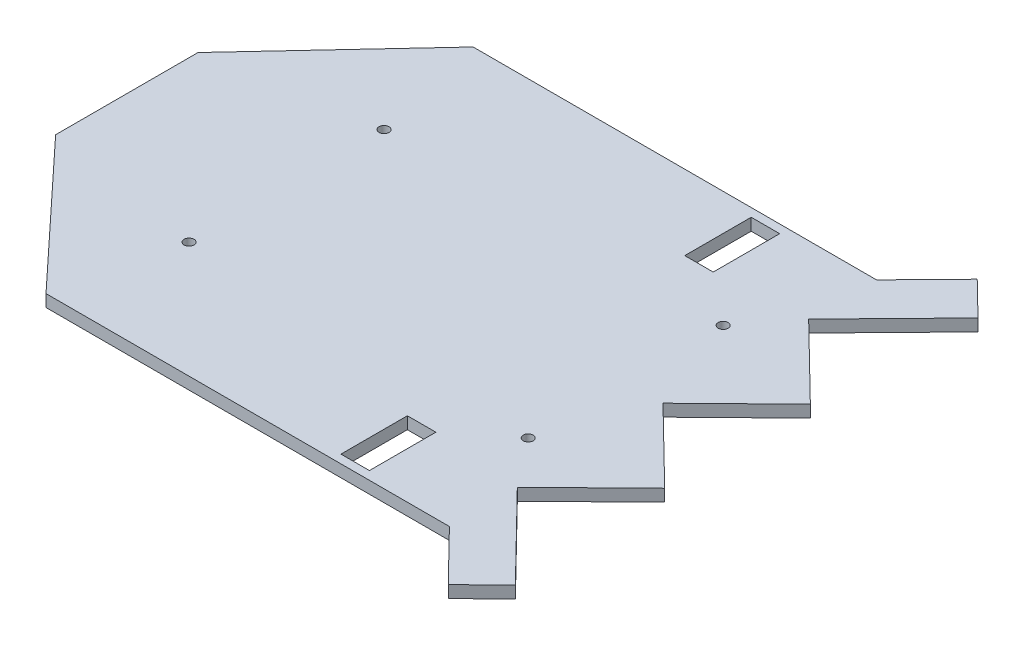
ISO-10303-21;
HEADER;
FILE_DESCRIPTION(('STEP AP214'),'2;1');
FILE_NAME('part.step','',(''),(''),'','','');
FILE_SCHEMA(('AUTOMOTIVE_DESIGN { 1 0 10303 214 1 1 1 1 }'));
ENDSEC;
DATA;
#1=APPLICATION_CONTEXT('core data for automotive mechanical design processes');
#2=APPLICATION_PROTOCOL_DEFINITION('international standard','automotive_design',2000,#1);
#3=PRODUCT_CONTEXT('',#1,'mechanical');
#4=PRODUCT('Part','Part','',(#3));
#5=PRODUCT_RELATED_PRODUCT_CATEGORY('part','',(#4));
#6=PRODUCT_DEFINITION_FORMATION('','',#4);
#7=PRODUCT_DEFINITION_CONTEXT('part definition',#1,'design');
#8=PRODUCT_DEFINITION('design','',#6,#7);
#9=PRODUCT_DEFINITION_SHAPE('','',#8);
#10=(LENGTH_UNIT() NAMED_UNIT(*) SI_UNIT(.MILLI.,.METRE.));
#11=(NAMED_UNIT(*) PLANE_ANGLE_UNIT() SI_UNIT($,.RADIAN.));
#12=(NAMED_UNIT(*) SI_UNIT($,.STERADIAN.) SOLID_ANGLE_UNIT());
#13=UNCERTAINTY_MEASURE_WITH_UNIT(LENGTH_MEASURE(1.E-05),#10,'distance_accuracy_value','');
#14=(GEOMETRIC_REPRESENTATION_CONTEXT(3) GLOBAL_UNCERTAINTY_ASSIGNED_CONTEXT((#13)) GLOBAL_UNIT_ASSIGNED_CONTEXT((#10,
#11,#12)) REPRESENTATION_CONTEXT('',''));
#15=CARTESIAN_POINT('',(0.,0.,0.));
#16=DIRECTION('',(0.,0.,1.));
#17=DIRECTION('',(1.,0.,0.));
#18=AXIS2_PLACEMENT_3D('',#15,#16,#17);
#19=CARTESIAN_POINT('',(0.,-0.1,0.));
#20=DIRECTION('',(0.,1.,0.));
#21=DIRECTION('',(0.,0.,1.));
#22=AXIS2_PLACEMENT_3D('',#19,#20,#21);
#23=PLANE('',#22);
#24=DIRECTION('',(0.71519160898376,0.,-0.69892843871116));
#25=VECTOR('',#24,1.);
#26=CARTESIAN_POINT('',(246.912660031566,-0.1,111.455748269513));
#27=LINE('',#26,#25);
#28=CARTESIAN_POINT('',(246.912660031566,-0.1,111.455748269513));
#29=VERTEX_POINT('',#28);
#30=CARTESIAN_POINT('',(261.216492211241,-0.1,97.4771794952896));
#31=VERTEX_POINT('',#30);
#32=EDGE_CURVE('E297',#29,#31,#27,.T.);
#33=ORIENTED_EDGE('',*,*,#32,.F.);
#34=DIRECTION('',(0.698928438711159,0.,0.715191608983762));
#35=VECTOR('',#34,1.);
#36=CARTESIAN_POINT('',(225.944806870231,-0.1,90.));
#37=LINE('',#36,#35);
#38=CARTESIAN_POINT('',(225.944806870231,-0.1,90.));
#39=VERTEX_POINT('',#38);
#40=EDGE_CURVE('E339',#39,#29,#37,.T.);
#41=ORIENTED_EDGE('',*,*,#40,.F.);
#42=DIRECTION('',(1.,0.,0.));
#43=VECTOR('',#42,1.);
#44=CARTESIAN_POINT('',(55.9448068702312,-0.1,90.));
#45=LINE('',#44,#43);
#46=CARTESIAN_POINT('',(55.9448068702312,-0.1,90.));
#47=VERTEX_POINT('',#46);
#48=EDGE_CURVE('E336',#47,#39,#45,.T.);
#49=ORIENTED_EDGE('',*,*,#48,.F.);
#50=DIRECTION('',(0.681958597642219,0.,0.731390778655199));
#51=VECTOR('',#50,1.);
#52=CARTESIAN_POINT('',(0.,-0.1,30.));
#53=LINE('',#52,#51);
#54=CARTESIAN_POINT('',(0.,-0.1,30.));
#55=VERTEX_POINT('',#54);
#56=EDGE_CURVE('E333',#55,#47,#53,.T.);
#57=ORIENTED_EDGE('',*,*,#56,.F.);
#58=DIRECTION('',(0.,0.,1.));
#59=VECTOR('',#58,1.);
#60=CARTESIAN_POINT('',(0.,-0.1,30.));
#61=LINE('',#60,#59);
#62=CARTESIAN_POINT('',(0.,-0.1,-30.));
#63=VERTEX_POINT('',#62);
#64=EDGE_CURVE('E330',#63,#55,#61,.T.);
#65=ORIENTED_EDGE('',*,*,#64,.F.);
#66=DIRECTION('',(-0.68195859764222,0.,0.731390778655198));
#67=VECTOR('',#66,1.);
#68=CARTESIAN_POINT('',(0.,-0.1,-30.));
#69=LINE('',#68,#67);
#70=CARTESIAN_POINT('',(55.9448068702314,-0.1,-90.));
#71=VERTEX_POINT('',#70);
#72=EDGE_CURVE('E327',#71,#63,#69,.T.);
#73=ORIENTED_EDGE('',*,*,#72,.F.);
#74=DIRECTION('',(-1.,0.,0.));
#75=VECTOR('',#74,1.);
#76=CARTESIAN_POINT('',(55.9448068702314,-0.1,-90.));
#77=LINE('',#76,#75);
#78=CARTESIAN_POINT('',(225.944806870231,-0.1,-90.));
#79=VERTEX_POINT('',#78);
#80=EDGE_CURVE('E324',#79,#71,#77,.T.);
#81=ORIENTED_EDGE('',*,*,#80,.F.);
#82=DIRECTION('',(-0.698928438711159,0.,0.715191608983762));
#83=VECTOR('',#82,1.);
#84=CARTESIAN_POINT('',(225.944806870231,-0.1,-90.));
#85=LINE('',#84,#83);
#86=CARTESIAN_POINT('',(246.912660031566,-0.1,-111.455748269513));
#87=VERTEX_POINT('',#86);
#88=EDGE_CURVE('E321',#87,#79,#85,.T.);
#89=ORIENTED_EDGE('',*,*,#88,.F.);
#90=DIRECTION('',(-0.71519160898376,0.,-0.69892843871116));
#91=VECTOR('',#90,1.);
#92=CARTESIAN_POINT('',(246.912660031566,-0.1,-111.455748269513));
#93=LINE('',#92,#91);
#94=CARTESIAN_POINT('',(261.216492211241,-0.1,-97.4771794952896));
#95=VERTEX_POINT('',#94);
#96=EDGE_CURVE('E318',#95,#87,#93,.T.);
#97=ORIENTED_EDGE('',*,*,#96,.F.);
#98=DIRECTION('',(0.698928438711159,0.,-0.715191608983762));
#99=VECTOR('',#98,1.);
#100=CARTESIAN_POINT('',(261.216492211241,-0.1,-97.4771794952896));
#101=LINE('',#100,#99);
#102=CARTESIAN_POINT('',(225.944806870231,-0.1,-61.3847671774803));
#103=VERTEX_POINT('',#102);
#104=EDGE_CURVE('E315',#103,#95,#101,.T.);
#105=ORIENTED_EDGE('',*,*,#104,.F.);
#106=DIRECTION('',(-0.715191608983761,0.,-0.69892843871116));
#107=VECTOR('',#106,1.);
#108=CARTESIAN_POINT('',(225.944806870231,-0.1,-61.3847671774803));
#109=LINE('',#108,#107);
#110=CARTESIAN_POINT('',(257.353801996435,-0.1,-30.69));
#111=VERTEX_POINT('',#110);
#112=EDGE_CURVE('E312',#111,#103,#109,.T.);
#113=ORIENTED_EDGE('',*,*,#112,.F.);
#114=DIRECTION('',(0.715245871572463,0.,-0.69887290918918));
#115=VECTOR('',#114,1.);
#116=CARTESIAN_POINT('',(257.353801996435,-0.1,-30.69));
#117=LINE('',#116,#115);
#118=CARTESIAN_POINT('',(225.944806870231,-0.1,0.));
#119=VERTEX_POINT('',#118);
#120=EDGE_CURVE('E309',#119,#111,#117,.T.);
#121=ORIENTED_EDGE('',*,*,#120,.F.);
#122=DIRECTION('',(-0.715245871572463,0.,-0.69887290918918));
#123=VECTOR('',#122,1.);
#124=CARTESIAN_POINT('',(257.353801996435,-0.1,30.69));
#125=LINE('',#124,#123);
#126=CARTESIAN_POINT('',(257.353801996435,-0.1,30.69));
#127=VERTEX_POINT('',#126);
#128=EDGE_CURVE('E306',#127,#119,#125,.T.);
#129=ORIENTED_EDGE('',*,*,#128,.F.);
#130=DIRECTION('',(0.715191608983761,0.,-0.69892843871116));
#131=VECTOR('',#130,1.);
#132=CARTESIAN_POINT('',(225.944806870231,-0.1,61.3847671774803));
#133=LINE('',#132,#131);
#134=CARTESIAN_POINT('',(225.944806870231,-0.1,61.3847671774803));
#135=VERTEX_POINT('',#134);
#136=EDGE_CURVE('E303',#135,#127,#133,.T.);
#137=ORIENTED_EDGE('',*,*,#136,.F.);
#138=DIRECTION('',(-0.698928438711159,0.,-0.715191608983762));
#139=VECTOR('',#138,1.);
#140=CARTESIAN_POINT('',(261.216492211241,-0.1,97.4771794952896));
#141=LINE('',#140,#139);
#142=EDGE_CURVE('E300',#31,#135,#141,.T.);
#143=ORIENTED_EDGE('',*,*,#142,.F.);
#144=EDGE_LOOP('',(#33,#41,#49,#57,#65,#73,#81,#89,#97,#105,#113,#121,#129,#137,#143));
#145=FACE_BOUND('',#144,.T.);
#146=CARTESIAN_POINT('',(67.3097527531761,-0.1,-41.0819672181388));
#147=DIRECTION('',(0.,-1.,0.));
#148=DIRECTION('',(0.,0.,-1.));
#149=AXIS2_PLACEMENT_3D('',#146,#147,#148);
#150=CIRCLE('',#149,2.1);
#151=CARTESIAN_POINT('',(67.3097527531761,-0.1,-43.1819672181388));
#152=VERTEX_POINT('',#151);
#153=EDGE_CURVE('E242',#152,#152,#150,.T.);
#154=ORIENTED_EDGE('',*,*,#153,.F.);
#155=EDGE_LOOP('',(#154));
#156=FACE_BOUND('',#155,.T.);
#157=CARTESIAN_POINT('',(210.227358503643,-0.1,-41.0819672181388));
#158=DIRECTION('',(0.,-1.,0.));
#159=DIRECTION('',(0.,0.,-1.));
#160=AXIS2_PLACEMENT_3D('',#157,#158,#159);
#161=CIRCLE('',#160,2.09999999999999);
#162=CARTESIAN_POINT('',(210.227358503643,-0.1,-43.1819672181388));
#163=VERTEX_POINT('',#162);
#164=EDGE_CURVE('E239',#163,#163,#161,.T.);
#165=ORIENTED_EDGE('',*,*,#164,.F.);
#166=EDGE_LOOP('',(#165));
#167=FACE_BOUND('',#166,.T.);
#168=CARTESIAN_POINT('',(210.227358503643,-0.1,41.0819672181388));
#169=DIRECTION('',(0.,-1.,0.));
#170=DIRECTION('',(0.,0.,1.));
#171=AXIS2_PLACEMENT_3D('',#168,#169,#170);
#172=CIRCLE('',#171,2.09999999999999);
#173=CARTESIAN_POINT('',(210.227358503643,-0.1,43.1819672181388));
#174=VERTEX_POINT('',#173);
#175=EDGE_CURVE('E243',#174,#174,#172,.T.);
#176=ORIENTED_EDGE('',*,*,#175,.F.);
#177=EDGE_LOOP('',(#176));
#178=FACE_BOUND('',#177,.T.);
#179=CARTESIAN_POINT('',(67.3097527531761,-0.1,41.0819672181388));
#180=DIRECTION('',(0.,-1.,0.));
#181=DIRECTION('',(0.,0.,1.));
#182=AXIS2_PLACEMENT_3D('',#179,#180,#181);
#183=CIRCLE('',#182,2.1);
#184=CARTESIAN_POINT('',(67.3097527531761,-0.1,43.1819672181388));
#185=VERTEX_POINT('',#184);
#186=EDGE_CURVE('E197',#185,#185,#183,.T.);
#187=ORIENTED_EDGE('',*,*,#186,.F.);
#188=EDGE_LOOP('',(#187));
#189=FACE_BOUND('',#188,.T.);
#190=DIRECTION('',(-1.,0.,0.));
#191=VECTOR('',#190,1.);
#192=CARTESIAN_POINT('',(188.67460317135,-0.1,-58.444256033032));
#193=LINE('',#192,#191);
#194=CARTESIAN_POINT('',(188.67460317135,-0.1,-58.444256033032));
#195=VERTEX_POINT('',#194);
#196=CARTESIAN_POINT('',(176.67460317135,-0.1,-58.444256033032));
#197=VERTEX_POINT('',#196);
#198=EDGE_CURVE('E213',#195,#197,#193,.T.);
#199=ORIENTED_EDGE('',*,*,#198,.F.);
#200=DIRECTION('',(0.,0.,1.));
#201=VECTOR('',#200,1.);
#202=CARTESIAN_POINT('',(188.67460317135,-0.1,-86.444256033032));
#203=LINE('',#202,#201);
#204=CARTESIAN_POINT('',(188.67460317135,-0.1,-86.444256033032));
#205=VERTEX_POINT('',#204);
#206=EDGE_CURVE('E60',#205,#195,#203,.T.);
#207=ORIENTED_EDGE('',*,*,#206,.F.);
#208=DIRECTION('',(-1.,0.,0.));
#209=VECTOR('',#208,1.);
#210=CARTESIAN_POINT('',(188.67460317135,-0.1,-86.444256033032));
#211=LINE('',#210,#209);
#212=CARTESIAN_POINT('',(176.67460317135,-0.1,-86.444256033032));
#213=VERTEX_POINT('',#212);
#214=EDGE_CURVE('E225',#205,#213,#211,.T.);
#215=ORIENTED_EDGE('',*,*,#214,.T.);
#216=DIRECTION('',(0.,0.,1.));
#217=VECTOR('',#216,1.);
#218=CARTESIAN_POINT('',(176.67460317135,-0.1,-86.444256033032));
#219=LINE('',#218,#217);
#220=EDGE_CURVE('E234',#213,#197,#219,.T.);
#221=ORIENTED_EDGE('',*,*,#220,.T.);
#222=EDGE_LOOP('',(#199,#207,#215,#221));
#223=FACE_BOUND('',#222,.T.);
#224=DIRECTION('',(-1.,0.,0.));
#225=VECTOR('',#224,1.);
#226=CARTESIAN_POINT('',(188.67460317135,-0.1,58.444256033032));
#227=LINE('',#226,#225);
#228=CARTESIAN_POINT('',(188.67460317135,-0.1,58.444256033032));
#229=VERTEX_POINT('',#228);
#230=CARTESIAN_POINT('',(176.67460317135,-0.1,58.444256033032));
#231=VERTEX_POINT('',#230);
#232=EDGE_CURVE('E52',#229,#231,#227,.T.);
#233=ORIENTED_EDGE('',*,*,#232,.T.);
#234=DIRECTION('',(0.,0.,-1.));
#235=VECTOR('',#234,1.);
#236=CARTESIAN_POINT('',(176.67460317135,-0.1,86.444256033032));
#237=LINE('',#236,#235);
#238=CARTESIAN_POINT('',(176.67460317135,-0.1,86.444256033032));
#239=VERTEX_POINT('',#238);
#240=EDGE_CURVE('E201',#239,#231,#237,.T.);
#241=ORIENTED_EDGE('',*,*,#240,.F.);
#242=DIRECTION('',(-1.,0.,0.));
#243=VECTOR('',#242,1.);
#244=CARTESIAN_POINT('',(188.67460317135,-0.1,86.444256033032));
#245=LINE('',#244,#243);
#246=CARTESIAN_POINT('',(188.67460317135,-0.1,86.444256033032));
#247=VERTEX_POINT('',#246);
#248=EDGE_CURVE('E207',#247,#239,#245,.T.);
#249=ORIENTED_EDGE('',*,*,#248,.F.);
#250=DIRECTION('',(0.,0.,-1.));
#251=VECTOR('',#250,1.);
#252=CARTESIAN_POINT('',(188.67460317135,-0.1,86.444256033032));
#253=LINE('',#252,#251);
#254=EDGE_CURVE('E211',#247,#229,#253,.T.);
#255=ORIENTED_EDGE('',*,*,#254,.T.);
#256=EDGE_LOOP('',(#233,#241,#249,#255));
#257=FACE_BOUND('',#256,.T.);
#258=ADVANCED_FACE('F37',(#145,#156,#167,#178,#189,#223,#257),#23,.F.);
#259=CARTESIAN_POINT('',(0.,5.,0.));
#260=DIRECTION('',(0.,1.,0.));
#261=DIRECTION('',(0.,0.,1.));
#262=AXIS2_PLACEMENT_3D('',#259,#260,#261);
#263=PLANE('',#262);
#264=DIRECTION('',(0.,0.,-1.));
#265=VECTOR('',#264,1.);
#266=CARTESIAN_POINT('',(188.67460317135,5.,0.));
#267=LINE('',#266,#265);
#268=CARTESIAN_POINT('',(188.67460317135,5.,-58.444256033032));
#269=VERTEX_POINT('',#268);
#270=CARTESIAN_POINT('',(188.67460317135,5.,-86.444256033032));
#271=VERTEX_POINT('',#270);
#272=EDGE_CURVE('E390',#269,#271,#267,.T.);
#273=ORIENTED_EDGE('',*,*,#272,.F.);
#274=DIRECTION('',(1.,0.,0.));
#275=VECTOR('',#274,1.);
#276=CARTESIAN_POINT('',(0.,5.,-58.444256033032));
#277=LINE('',#276,#275);
#278=CARTESIAN_POINT('',(176.67460317135,5.,-58.444256033032));
#279=VERTEX_POINT('',#278);
#280=EDGE_CURVE('E345',#279,#269,#277,.T.);
#281=ORIENTED_EDGE('',*,*,#280,.F.);
#282=DIRECTION('',(0.,0.,-1.));
#283=VECTOR('',#282,1.);
#284=CARTESIAN_POINT('',(176.67460317135,5.,0.));
#285=LINE('',#284,#283);
#286=CARTESIAN_POINT('',(176.67460317135,5.,-86.444256033032));
#287=VERTEX_POINT('',#286);
#288=EDGE_CURVE('E384',#279,#287,#285,.T.);
#289=ORIENTED_EDGE('',*,*,#288,.T.);
#290=DIRECTION('',(1.,0.,0.));
#291=VECTOR('',#290,1.);
#292=CARTESIAN_POINT('',(0.,5.,-86.444256033032));
#293=LINE('',#292,#291);
#294=EDGE_CURVE('E387',#287,#271,#293,.T.);
#295=ORIENTED_EDGE('',*,*,#294,.T.);
#296=EDGE_LOOP('',(#273,#281,#289,#295));
#297=FACE_BOUND('',#296,.T.);
#298=CARTESIAN_POINT('',(67.3097527531761,5.,41.0819672181388));
#299=DIRECTION('',(0.,1.,0.));
#300=DIRECTION('',(0.,0.,1.));
#301=AXIS2_PLACEMENT_3D('',#298,#299,#300);
#302=CIRCLE('',#301,2.1);
#303=CARTESIAN_POINT('',(67.3097527531761,5.,43.1819672181388));
#304=VERTEX_POINT('',#303);
#305=EDGE_CURVE('E255',#304,#304,#302,.T.);
#306=ORIENTED_EDGE('',*,*,#305,.F.);
#307=EDGE_LOOP('',(#306));
#308=FACE_BOUND('',#307,.T.);
#309=CARTESIAN_POINT('',(210.227358503643,5.,41.0819672181388));
#310=DIRECTION('',(0.,1.,0.));
#311=DIRECTION('',(0.,0.,1.));
#312=AXIS2_PLACEMENT_3D('',#309,#310,#311);
#313=CIRCLE('',#312,2.09999999999999);
#314=CARTESIAN_POINT('',(210.227358503643,5.,43.1819672181388));
#315=VERTEX_POINT('',#314);
#316=EDGE_CURVE('E378',#315,#315,#313,.T.);
#317=ORIENTED_EDGE('',*,*,#316,.F.);
#318=EDGE_LOOP('',(#317));
#319=FACE_BOUND('',#318,.T.);
#320=CARTESIAN_POINT('',(210.227358503643,5.,-41.0819672181388));
#321=DIRECTION('',(0.,1.,0.));
#322=DIRECTION('',(0.,0.,1.));
#323=AXIS2_PLACEMENT_3D('',#320,#321,#322);
#324=CIRCLE('',#323,2.09999999999999);
#325=CARTESIAN_POINT('',(210.227358503643,5.,-38.9819672181388));
#326=VERTEX_POINT('',#325);
#327=EDGE_CURVE('E375',#326,#326,#324,.T.);
#328=ORIENTED_EDGE('',*,*,#327,.F.);
#329=EDGE_LOOP('',(#328));
#330=FACE_BOUND('',#329,.T.);
#331=CARTESIAN_POINT('',(67.3097527531761,5.,-41.0819672181388));
#332=DIRECTION('',(0.,1.,0.));
#333=DIRECTION('',(0.,0.,1.));
#334=AXIS2_PLACEMENT_3D('',#331,#332,#333);
#335=CIRCLE('',#334,2.1);
#336=CARTESIAN_POINT('',(67.3097527531761,5.,-38.9819672181388));
#337=VERTEX_POINT('',#336);
#338=EDGE_CURVE('E250',#337,#337,#335,.T.);
#339=ORIENTED_EDGE('',*,*,#338,.F.);
#340=EDGE_LOOP('',(#339));
#341=FACE_BOUND('',#340,.T.);
#342=DIRECTION('',(0.71519160898376,0.,-0.69892843871116));
#343=VECTOR('',#342,1.);
#344=CARTESIAN_POINT('',(246.912660031566,5.,111.455748269513));
#345=LINE('',#344,#343);
#346=CARTESIAN_POINT('',(246.912660031566,5.,111.455748269513));
#347=VERTEX_POINT('',#346);
#348=CARTESIAN_POINT('',(261.216492211241,5.,97.4771794952896));
#349=VERTEX_POINT('',#348);
#350=EDGE_CURVE('E251',#347,#349,#345,.T.);
#351=ORIENTED_EDGE('',*,*,#350,.T.);
#352=DIRECTION('',(-0.698928438711159,0.,-0.715191608983762));
#353=VECTOR('',#352,1.);
#354=CARTESIAN_POINT('',(261.216492211241,5.,97.4771794952896));
#355=LINE('',#354,#353);
#356=CARTESIAN_POINT('',(225.944806870231,5.,61.3847671774803));
#357=VERTEX_POINT('',#356);
#358=EDGE_CURVE('E254',#349,#357,#355,.T.);
#359=ORIENTED_EDGE('',*,*,#358,.T.);
#360=DIRECTION('',(0.715191608983761,0.,-0.69892843871116));
#361=VECTOR('',#360,1.);
#362=CARTESIAN_POINT('',(225.944806870231,5.,61.3847671774803));
#363=LINE('',#362,#361);
#364=CARTESIAN_POINT('',(257.353801996435,5.,30.69));
#365=VERTEX_POINT('',#364);
#366=EDGE_CURVE('E258',#357,#365,#363,.T.);
#367=ORIENTED_EDGE('',*,*,#366,.T.);
#368=DIRECTION('',(-0.715245871572463,0.,-0.69887290918918));
#369=VECTOR('',#368,1.);
#370=CARTESIAN_POINT('',(257.353801996435,5.,30.69));
#371=LINE('',#370,#369);
#372=CARTESIAN_POINT('',(225.944806870231,5.,0.));
#373=VERTEX_POINT('',#372);
#374=EDGE_CURVE('E261',#365,#373,#371,.T.);
#375=ORIENTED_EDGE('',*,*,#374,.T.);
#376=DIRECTION('',(0.715245871572463,0.,-0.69887290918918));
#377=VECTOR('',#376,1.);
#378=CARTESIAN_POINT('',(257.353801996435,5.,-30.69));
#379=LINE('',#378,#377);
#380=CARTESIAN_POINT('',(257.353801996435,5.,-30.69));
#381=VERTEX_POINT('',#380);
#382=EDGE_CURVE('E264',#373,#381,#379,.T.);
#383=ORIENTED_EDGE('',*,*,#382,.T.);
#384=DIRECTION('',(-0.715191608983761,0.,-0.69892843871116));
#385=VECTOR('',#384,1.);
#386=CARTESIAN_POINT('',(225.944806870231,5.,-61.3847671774803));
#387=LINE('',#386,#385);
#388=CARTESIAN_POINT('',(225.944806870231,5.,-61.3847671774803));
#389=VERTEX_POINT('',#388);
#390=EDGE_CURVE('E267',#381,#389,#387,.T.);
#391=ORIENTED_EDGE('',*,*,#390,.T.);
#392=DIRECTION('',(0.698928438711159,0.,-0.715191608983762));
#393=VECTOR('',#392,1.);
#394=CARTESIAN_POINT('',(261.216492211241,5.,-97.4771794952896));
#395=LINE('',#394,#393);
#396=CARTESIAN_POINT('',(261.216492211241,5.,-97.4771794952896));
#397=VERTEX_POINT('',#396);
#398=EDGE_CURVE('E270',#389,#397,#395,.T.);
#399=ORIENTED_EDGE('',*,*,#398,.T.);
#400=DIRECTION('',(-0.71519160898376,0.,-0.69892843871116));
#401=VECTOR('',#400,1.);
#402=CARTESIAN_POINT('',(246.912660031566,5.,-111.455748269513));
#403=LINE('',#402,#401);
#404=CARTESIAN_POINT('',(246.912660031566,5.,-111.455748269513));
#405=VERTEX_POINT('',#404);
#406=EDGE_CURVE('E273',#397,#405,#403,.T.);
#407=ORIENTED_EDGE('',*,*,#406,.T.);
#408=DIRECTION('',(-0.698928438711159,0.,0.715191608983762));
#409=VECTOR('',#408,1.);
#410=CARTESIAN_POINT('',(225.944806870231,5.,-90.));
#411=LINE('',#410,#409);
#412=CARTESIAN_POINT('',(225.944806870231,5.,-90.));
#413=VERTEX_POINT('',#412);
#414=EDGE_CURVE('E276',#405,#413,#411,.T.);
#415=ORIENTED_EDGE('',*,*,#414,.T.);
#416=DIRECTION('',(-1.,0.,0.));
#417=VECTOR('',#416,1.);
#418=CARTESIAN_POINT('',(55.9448068702314,5.,-90.));
#419=LINE('',#418,#417);
#420=CARTESIAN_POINT('',(55.9448068702314,5.,-90.));
#421=VERTEX_POINT('',#420);
#422=EDGE_CURVE('E279',#413,#421,#419,.T.);
#423=ORIENTED_EDGE('',*,*,#422,.T.);
#424=DIRECTION('',(-0.68195859764222,0.,0.731390778655198));
#425=VECTOR('',#424,1.);
#426=CARTESIAN_POINT('',(0.,5.,-30.));
#427=LINE('',#426,#425);
#428=CARTESIAN_POINT('',(0.,5.,-30.));
#429=VERTEX_POINT('',#428);
#430=EDGE_CURVE('E282',#421,#429,#427,.T.);
#431=ORIENTED_EDGE('',*,*,#430,.T.);
#432=DIRECTION('',(0.,0.,1.));
#433=VECTOR('',#432,1.);
#434=CARTESIAN_POINT('',(0.,5.,30.));
#435=LINE('',#434,#433);
#436=CARTESIAN_POINT('',(0.,5.,30.));
#437=VERTEX_POINT('',#436);
#438=EDGE_CURVE('E285',#429,#437,#435,.T.);
#439=ORIENTED_EDGE('',*,*,#438,.T.);
#440=DIRECTION('',(0.681958597642219,0.,0.731390778655199));
#441=VECTOR('',#440,1.);
#442=CARTESIAN_POINT('',(0.,5.,30.));
#443=LINE('',#442,#441);
#444=CARTESIAN_POINT('',(55.9448068702312,5.,90.));
#445=VERTEX_POINT('',#444);
#446=EDGE_CURVE('E288',#437,#445,#443,.T.);
#447=ORIENTED_EDGE('',*,*,#446,.T.);
#448=DIRECTION('',(1.,0.,0.));
#449=VECTOR('',#448,1.);
#450=CARTESIAN_POINT('',(55.9448068702312,5.,90.));
#451=LINE('',#450,#449);
#452=CARTESIAN_POINT('',(225.944806870231,5.,90.));
#453=VERTEX_POINT('',#452);
#454=EDGE_CURVE('E291',#445,#453,#451,.T.);
#455=ORIENTED_EDGE('',*,*,#454,.T.);
#456=DIRECTION('',(0.698928438711159,0.,0.715191608983762));
#457=VECTOR('',#456,1.);
#458=CARTESIAN_POINT('',(225.944806870231,5.,90.));
#459=LINE('',#458,#457);
#460=EDGE_CURVE('E294',#453,#347,#459,.T.);
#461=ORIENTED_EDGE('',*,*,#460,.T.);
#462=EDGE_LOOP('',(#351,#359,#367,#375,#383,#391,#399,#407,#415,#423,#431,#439,#447,#455,#461));
#463=FACE_BOUND('',#462,.T.);
#464=DIRECTION('',(0.,0.,1.));
#465=VECTOR('',#464,1.);
#466=CARTESIAN_POINT('',(176.67460317135,5.,0.));
#467=LINE('',#466,#465);
#468=CARTESIAN_POINT('',(176.67460317135,5.,58.444256033032));
#469=VERTEX_POINT('',#468);
#470=CARTESIAN_POINT('',(176.67460317135,5.,86.444256033032));
#471=VERTEX_POINT('',#470);
#472=EDGE_CURVE('E45',#469,#471,#467,.T.);
#473=ORIENTED_EDGE('',*,*,#472,.F.);
#474=DIRECTION('',(1.,0.,0.));
#475=VECTOR('',#474,1.);
#476=CARTESIAN_POINT('',(0.,5.,58.444256033032));
#477=LINE('',#476,#475);
#478=CARTESIAN_POINT('',(188.67460317135,5.,58.444256033032));
#479=VERTEX_POINT('',#478);
#480=EDGE_CURVE('E11',#469,#479,#477,.T.);
#481=ORIENTED_EDGE('',*,*,#480,.T.);
#482=DIRECTION('',(0.,0.,1.));
#483=VECTOR('',#482,1.);
#484=CARTESIAN_POINT('',(188.67460317135,5.,0.));
#485=LINE('',#484,#483);
#486=CARTESIAN_POINT('',(188.67460317135,5.,86.444256033032));
#487=VERTEX_POINT('',#486);
#488=EDGE_CURVE('E392',#479,#487,#485,.T.);
#489=ORIENTED_EDGE('',*,*,#488,.T.);
#490=DIRECTION('',(1.,0.,0.));
#491=VECTOR('',#490,1.);
#492=CARTESIAN_POINT('',(0.,5.,86.444256033032));
#493=LINE('',#492,#491);
#494=EDGE_CURVE('E395',#471,#487,#493,.T.);
#495=ORIENTED_EDGE('',*,*,#494,.F.);
#496=EDGE_LOOP('',(#473,#481,#489,#495));
#497=FACE_BOUND('',#496,.T.);
#498=ADVANCED_FACE('F401',(#297,#308,#319,#330,#341,#463,#497),#263,.T.);
#499=CARTESIAN_POINT('',(246.912660031566,-0.1,111.455748269513));
#500=DIRECTION('',(0.69892843871116,0.,0.71519160898376));
#501=DIRECTION('',(0.71519160898376,0.,-0.69892843871116));
#502=AXIS2_PLACEMENT_3D('',#499,#500,#501);
#503=PLANE('',#502);
#504=DIRECTION('',(0.,1.,0.));
#505=VECTOR('',#504,1.);
#506=CARTESIAN_POINT('',(261.216492211241,-0.1,97.4771794952896));
#507=LINE('',#506,#505);
#508=EDGE_CURVE('E342',#31,#349,#507,.T.);
#509=ORIENTED_EDGE('',*,*,#508,.T.);
#510=ORIENTED_EDGE('',*,*,#350,.F.);
#511=DIRECTION('',(0.,1.,0.));
#512=VECTOR('',#511,1.);
#513=CARTESIAN_POINT('',(246.912660031566,-0.1,111.455748269513));
#514=LINE('',#513,#512);
#515=EDGE_CURVE('E343',#29,#347,#514,.T.);
#516=ORIENTED_EDGE('',*,*,#515,.F.);
#517=ORIENTED_EDGE('',*,*,#32,.T.);
#518=EDGE_LOOP('',(#509,#510,#516,#517));
#519=FACE_BOUND('',#518,.T.);
#520=ADVANCED_FACE('F39',(#519),#503,.T.);
#521=CARTESIAN_POINT('',(225.944806870231,-0.1,90.));
#522=DIRECTION('',(-0.715191608983762,0.,0.698928438711159));
#523=DIRECTION('',(0.698928438711159,0.,0.715191608983762));
#524=AXIS2_PLACEMENT_3D('',#521,#522,#523);
#525=PLANE('',#524);
#526=ORIENTED_EDGE('',*,*,#515,.T.);
#527=ORIENTED_EDGE('',*,*,#460,.F.);
#528=DIRECTION('',(0.,1.,0.));
#529=VECTOR('',#528,1.);
#530=CARTESIAN_POINT('',(225.944806870231,-0.1,90.));
#531=LINE('',#530,#529);
#532=EDGE_CURVE('E346',#39,#453,#531,.T.);
#533=ORIENTED_EDGE('',*,*,#532,.F.);
#534=ORIENTED_EDGE('',*,*,#40,.T.);
#535=EDGE_LOOP('',(#526,#527,#533,#534));
#536=FACE_BOUND('',#535,.T.);
#537=ADVANCED_FACE('F422',(#536),#525,.T.);
#538=CARTESIAN_POINT('',(55.9448068702312,-0.1,90.));
#539=DIRECTION('',(0.,0.,1.));
#540=DIRECTION('',(1.,0.,0.));
#541=AXIS2_PLACEMENT_3D('',#538,#539,#540);
#542=PLANE('',#541);
#543=ORIENTED_EDGE('',*,*,#532,.T.);
#544=ORIENTED_EDGE('',*,*,#454,.F.);
#545=DIRECTION('',(0.,1.,0.));
#546=VECTOR('',#545,1.);
#547=CARTESIAN_POINT('',(55.9448068702312,-0.1,90.));
#548=LINE('',#547,#546);
#549=EDGE_CURVE('E348',#47,#445,#548,.T.);
#550=ORIENTED_EDGE('',*,*,#549,.F.);
#551=ORIENTED_EDGE('',*,*,#48,.T.);
#552=EDGE_LOOP('',(#543,#544,#550,#551));
#553=FACE_BOUND('',#552,.T.);
#554=ADVANCED_FACE('F425',(#553),#542,.T.);
#555=CARTESIAN_POINT('',(0.,-0.1,30.));
#556=DIRECTION('',(-0.731390778655199,0.,0.681958597642219));
#557=DIRECTION('',(0.681958597642219,0.,0.731390778655199));
#558=AXIS2_PLACEMENT_3D('',#555,#556,#557);
#559=PLANE('',#558);
#560=ORIENTED_EDGE('',*,*,#549,.T.);
#561=ORIENTED_EDGE('',*,*,#446,.F.);
#562=DIRECTION('',(0.,1.,0.));
#563=VECTOR('',#562,1.);
#564=CARTESIAN_POINT('',(0.,-0.1,30.));
#565=LINE('',#564,#563);
#566=EDGE_CURVE('E350',#55,#437,#565,.T.);
#567=ORIENTED_EDGE('',*,*,#566,.F.);
#568=ORIENTED_EDGE('',*,*,#56,.T.);
#569=EDGE_LOOP('',(#560,#561,#567,#568));
#570=FACE_BOUND('',#569,.T.);
#571=ADVANCED_FACE('F429',(#570),#559,.T.);
#572=CARTESIAN_POINT('',(0.,-0.1,30.));
#573=DIRECTION('',(-1.,0.,0.));
#574=DIRECTION('',(0.,0.,1.));
#575=AXIS2_PLACEMENT_3D('',#572,#573,#574);
#576=PLANE('',#575);
#577=ORIENTED_EDGE('',*,*,#566,.T.);
#578=ORIENTED_EDGE('',*,*,#438,.F.);
#579=DIRECTION('',(0.,1.,0.));
#580=VECTOR('',#579,1.);
#581=CARTESIAN_POINT('',(0.,-0.1,-30.));
#582=LINE('',#581,#580);
#583=EDGE_CURVE('E352',#63,#429,#582,.T.);
#584=ORIENTED_EDGE('',*,*,#583,.F.);
#585=ORIENTED_EDGE('',*,*,#64,.T.);
#586=EDGE_LOOP('',(#577,#578,#584,#585));
#587=FACE_BOUND('',#586,.T.);
#588=ADVANCED_FACE('F433',(#587),#576,.T.);
#589=CARTESIAN_POINT('',(0.,-0.1,-30.));
#590=DIRECTION('',(-0.731390778655198,0.,-0.68195859764222));
#591=DIRECTION('',(-0.68195859764222,0.,0.731390778655198));
#592=AXIS2_PLACEMENT_3D('',#589,#590,#591);
#593=PLANE('',#592);
#594=ORIENTED_EDGE('',*,*,#583,.T.);
#595=ORIENTED_EDGE('',*,*,#430,.F.);
#596=DIRECTION('',(0.,1.,0.));
#597=VECTOR('',#596,1.);
#598=CARTESIAN_POINT('',(55.9448068702314,-0.1,-90.));
#599=LINE('',#598,#597);
#600=EDGE_CURVE('E354',#71,#421,#599,.T.);
#601=ORIENTED_EDGE('',*,*,#600,.F.);
#602=ORIENTED_EDGE('',*,*,#72,.T.);
#603=EDGE_LOOP('',(#594,#595,#601,#602));
#604=FACE_BOUND('',#603,.T.);
#605=ADVANCED_FACE('F437',(#604),#593,.T.);
#606=CARTESIAN_POINT('',(55.9448068702314,-0.1,-90.));
#607=DIRECTION('',(0.,0.,-1.));
#608=DIRECTION('',(-1.,0.,0.));
#609=AXIS2_PLACEMENT_3D('',#606,#607,#608);
#610=PLANE('',#609);
#611=ORIENTED_EDGE('',*,*,#600,.T.);
#612=ORIENTED_EDGE('',*,*,#422,.F.);
#613=DIRECTION('',(0.,1.,0.));
#614=VECTOR('',#613,1.);
#615=CARTESIAN_POINT('',(225.944806870231,-0.1,-90.));
#616=LINE('',#615,#614);
#617=EDGE_CURVE('E356',#79,#413,#616,.T.);
#618=ORIENTED_EDGE('',*,*,#617,.F.);
#619=ORIENTED_EDGE('',*,*,#80,.T.);
#620=EDGE_LOOP('',(#611,#612,#618,#619));
#621=FACE_BOUND('',#620,.T.);
#622=ADVANCED_FACE('F441',(#621),#610,.T.);
#623=CARTESIAN_POINT('',(225.944806870231,-0.1,-90.));
#624=DIRECTION('',(-0.715191608983762,0.,-0.698928438711159));
#625=DIRECTION('',(-0.698928438711159,0.,0.715191608983762));
#626=AXIS2_PLACEMENT_3D('',#623,#624,#625);
#627=PLANE('',#626);
#628=ORIENTED_EDGE('',*,*,#617,.T.);
#629=ORIENTED_EDGE('',*,*,#414,.F.);
#630=DIRECTION('',(0.,1.,0.));
#631=VECTOR('',#630,1.);
#632=CARTESIAN_POINT('',(246.912660031566,-0.1,-111.455748269513));
#633=LINE('',#632,#631);
#634=EDGE_CURVE('E358',#87,#405,#633,.T.);
#635=ORIENTED_EDGE('',*,*,#634,.F.);
#636=ORIENTED_EDGE('',*,*,#88,.T.);
#637=EDGE_LOOP('',(#628,#629,#635,#636));
#638=FACE_BOUND('',#637,.T.);
#639=ADVANCED_FACE('F445',(#638),#627,.T.);
#640=CARTESIAN_POINT('',(246.912660031566,-0.1,-111.455748269513));
#641=DIRECTION('',(0.69892843871116,0.,-0.71519160898376));
#642=DIRECTION('',(-0.71519160898376,0.,-0.69892843871116));
#643=AXIS2_PLACEMENT_3D('',#640,#641,#642);
#644=PLANE('',#643);
#645=ORIENTED_EDGE('',*,*,#634,.T.);
#646=ORIENTED_EDGE('',*,*,#406,.F.);
#647=DIRECTION('',(0.,1.,0.));
#648=VECTOR('',#647,1.);
#649=CARTESIAN_POINT('',(261.216492211241,-0.1,-97.4771794952896));
#650=LINE('',#649,#648);
#651=EDGE_CURVE('E360',#95,#397,#650,.T.);
#652=ORIENTED_EDGE('',*,*,#651,.F.);
#653=ORIENTED_EDGE('',*,*,#96,.T.);
#654=EDGE_LOOP('',(#645,#646,#652,#653));
#655=FACE_BOUND('',#654,.T.);
#656=ADVANCED_FACE('F449',(#655),#644,.T.);
#657=CARTESIAN_POINT('',(261.216492211241,-0.1,-97.4771794952896));
#658=DIRECTION('',(0.715191608983762,0.,0.698928438711159));
#659=DIRECTION('',(0.698928438711159,0.,-0.715191608983762));
#660=AXIS2_PLACEMENT_3D('',#657,#658,#659);
#661=PLANE('',#660);
#662=ORIENTED_EDGE('',*,*,#651,.T.);
#663=ORIENTED_EDGE('',*,*,#398,.F.);
#664=DIRECTION('',(0.,1.,0.));
#665=VECTOR('',#664,1.);
#666=CARTESIAN_POINT('',(225.944806870231,-0.1,-61.3847671774803));
#667=LINE('',#666,#665);
#668=EDGE_CURVE('E362',#103,#389,#667,.T.);
#669=ORIENTED_EDGE('',*,*,#668,.F.);
#670=ORIENTED_EDGE('',*,*,#104,.T.);
#671=EDGE_LOOP('',(#662,#663,#669,#670));
#672=FACE_BOUND('',#671,.T.);
#673=ADVANCED_FACE('F453',(#672),#661,.T.);
#674=CARTESIAN_POINT('',(225.944806870231,-0.1,-61.3847671774803));
#675=DIRECTION('',(0.69892843871116,0.,-0.715191608983761));
#676=DIRECTION('',(-0.715191608983761,0.,-0.69892843871116));
#677=AXIS2_PLACEMENT_3D('',#674,#675,#676);
#678=PLANE('',#677);
#679=ORIENTED_EDGE('',*,*,#668,.T.);
#680=ORIENTED_EDGE('',*,*,#390,.F.);
#681=DIRECTION('',(0.,1.,0.));
#682=VECTOR('',#681,1.);
#683=CARTESIAN_POINT('',(257.353801996435,-0.1,-30.69));
#684=LINE('',#683,#682);
#685=EDGE_CURVE('E364',#111,#381,#684,.T.);
#686=ORIENTED_EDGE('',*,*,#685,.F.);
#687=ORIENTED_EDGE('',*,*,#112,.T.);
#688=EDGE_LOOP('',(#679,#680,#686,#687));
#689=FACE_BOUND('',#688,.T.);
#690=ADVANCED_FACE('F457',(#689),#678,.T.);
#691=CARTESIAN_POINT('',(257.353801996435,-0.1,-30.69));
#692=DIRECTION('',(0.69887290918918,0.,0.715245871572463));
#693=DIRECTION('',(0.715245871572463,0.,-0.69887290918918));
#694=AXIS2_PLACEMENT_3D('',#691,#692,#693);
#695=PLANE('',#694);
#696=ORIENTED_EDGE('',*,*,#685,.T.);
#697=ORIENTED_EDGE('',*,*,#382,.F.);
#698=DIRECTION('',(0.,1.,0.));
#699=VECTOR('',#698,1.);
#700=CARTESIAN_POINT('',(225.944806870231,-0.1,0.));
#701=LINE('',#700,#699);
#702=EDGE_CURVE('E366',#119,#373,#701,.T.);
#703=ORIENTED_EDGE('',*,*,#702,.F.);
#704=ORIENTED_EDGE('',*,*,#120,.T.);
#705=EDGE_LOOP('',(#696,#697,#703,#704));
#706=FACE_BOUND('',#705,.T.);
#707=ADVANCED_FACE('F461',(#706),#695,.T.);
#708=CARTESIAN_POINT('',(257.353801996435,-0.1,30.69));
#709=DIRECTION('',(0.69887290918918,0.,-0.715245871572463));
#710=DIRECTION('',(-0.715245871572463,0.,-0.69887290918918));
#711=AXIS2_PLACEMENT_3D('',#708,#709,#710);
#712=PLANE('',#711);
#713=ORIENTED_EDGE('',*,*,#702,.T.);
#714=ORIENTED_EDGE('',*,*,#374,.F.);
#715=DIRECTION('',(0.,1.,0.));
#716=VECTOR('',#715,1.);
#717=CARTESIAN_POINT('',(257.353801996435,-0.1,30.69));
#718=LINE('',#717,#716);
#719=EDGE_CURVE('E368',#127,#365,#718,.T.);
#720=ORIENTED_EDGE('',*,*,#719,.F.);
#721=ORIENTED_EDGE('',*,*,#128,.T.);
#722=EDGE_LOOP('',(#713,#714,#720,#721));
#723=FACE_BOUND('',#722,.T.);
#724=ADVANCED_FACE('F465',(#723),#712,.T.);
#725=CARTESIAN_POINT('',(225.944806870231,-0.1,61.3847671774803));
#726=DIRECTION('',(0.69892843871116,0.,0.715191608983761));
#727=DIRECTION('',(0.715191608983761,0.,-0.69892843871116));
#728=AXIS2_PLACEMENT_3D('',#725,#726,#727);
#729=PLANE('',#728);
#730=ORIENTED_EDGE('',*,*,#719,.T.);
#731=ORIENTED_EDGE('',*,*,#366,.F.);
#732=DIRECTION('',(0.,1.,0.));
#733=VECTOR('',#732,1.);
#734=CARTESIAN_POINT('',(225.944806870231,-0.1,61.3847671774803));
#735=LINE('',#734,#733);
#736=EDGE_CURVE('E370',#135,#357,#735,.T.);
#737=ORIENTED_EDGE('',*,*,#736,.F.);
#738=ORIENTED_EDGE('',*,*,#136,.T.);
#739=EDGE_LOOP('',(#730,#731,#737,#738));
#740=FACE_BOUND('',#739,.T.);
#741=ADVANCED_FACE('F469',(#740),#729,.T.);
#742=CARTESIAN_POINT('',(261.216492211241,-0.1,97.4771794952896));
#743=DIRECTION('',(0.715191608983762,0.,-0.698928438711159));
#744=DIRECTION('',(-0.698928438711159,0.,-0.715191608983762));
#745=AXIS2_PLACEMENT_3D('',#742,#743,#744);
#746=PLANE('',#745);
#747=ORIENTED_EDGE('',*,*,#736,.T.);
#748=ORIENTED_EDGE('',*,*,#358,.F.);
#749=ORIENTED_EDGE('',*,*,#508,.F.);
#750=ORIENTED_EDGE('',*,*,#142,.T.);
#751=EDGE_LOOP('',(#747,#748,#749,#750));
#752=FACE_BOUND('',#751,.T.);
#753=ADVANCED_FACE('F472',(#752),#746,.T.);
#754=CARTESIAN_POINT('',(67.3097527531761,9.9,-41.0819672181388));
#755=DIRECTION('',(0.,-1.,0.));
#756=DIRECTION('',(0.,0.,-1.));
#757=AXIS2_PLACEMENT_3D('',#754,#755,#756);
#758=CYLINDRICAL_SURFACE('',#757,2.1);
#759=ORIENTED_EDGE('',*,*,#338,.T.);
#760=EDGE_LOOP('',(#759));
#761=FACE_BOUND('',#760,.T.);
#762=ORIENTED_EDGE('',*,*,#153,.T.);
#763=EDGE_LOOP('',(#762));
#764=FACE_BOUND('',#763,.T.);
#765=ADVANCED_FACE('F475',(#761,#764),#758,.F.);
#766=CARTESIAN_POINT('',(210.227358503643,9.9,-41.0819672181388));
#767=DIRECTION('',(0.,-1.,0.));
#768=DIRECTION('',(0.,0.,-1.));
#769=AXIS2_PLACEMENT_3D('',#766,#767,#768);
#770=CYLINDRICAL_SURFACE('',#769,2.09999999999999);
#771=ORIENTED_EDGE('',*,*,#327,.T.);
#772=EDGE_LOOP('',(#771));
#773=FACE_BOUND('',#772,.T.);
#774=ORIENTED_EDGE('',*,*,#164,.T.);
#775=EDGE_LOOP('',(#774));
#776=FACE_BOUND('',#775,.T.);
#777=ADVANCED_FACE('F480',(#773,#776),#770,.F.);
#778=CARTESIAN_POINT('',(210.227358503643,9.9,41.0819672181388));
#779=DIRECTION('',(0.,-1.,0.));
#780=DIRECTION('',(0.,0.,-1.));
#781=AXIS2_PLACEMENT_3D('',#778,#779,#780);
#782=CYLINDRICAL_SURFACE('',#781,2.09999999999999);
#783=ORIENTED_EDGE('',*,*,#316,.T.);
#784=EDGE_LOOP('',(#783));
#785=FACE_BOUND('',#784,.T.);
#786=ORIENTED_EDGE('',*,*,#175,.T.);
#787=EDGE_LOOP('',(#786));
#788=FACE_BOUND('',#787,.T.);
#789=ADVANCED_FACE('F589',(#785,#788),#782,.F.);
#790=CARTESIAN_POINT('',(67.3097527531761,9.9,41.0819672181388));
#791=DIRECTION('',(0.,-1.,0.));
#792=DIRECTION('',(0.,0.,-1.));
#793=AXIS2_PLACEMENT_3D('',#790,#791,#792);
#794=CYLINDRICAL_SURFACE('',#793,2.1);
#795=ORIENTED_EDGE('',*,*,#305,.T.);
#796=EDGE_LOOP('',(#795));
#797=FACE_BOUND('',#796,.T.);
#798=ORIENTED_EDGE('',*,*,#186,.T.);
#799=EDGE_LOOP('',(#798));
#800=FACE_BOUND('',#799,.T.);
#801=ADVANCED_FACE('F599',(#797,#800),#794,.F.);
#802=CARTESIAN_POINT('',(188.67460317135,9.9,-86.444256033032));
#803=DIRECTION('',(1.,0.,0.));
#804=DIRECTION('',(0.,0.,-1.));
#805=AXIS2_PLACEMENT_3D('',#802,#803,#804);
#806=PLANE('',#805);
#807=ORIENTED_EDGE('',*,*,#272,.T.);
#808=DIRECTION('',(0.,-1.,0.));
#809=VECTOR('',#808,1.);
#810=CARTESIAN_POINT('',(188.67460317135,9.9,-86.444256033032));
#811=LINE('',#810,#809);
#812=EDGE_CURVE('E230',#271,#205,#811,.T.);
#813=ORIENTED_EDGE('',*,*,#812,.T.);
#814=ORIENTED_EDGE('',*,*,#206,.T.);
#815=DIRECTION('',(0.,-1.,0.));
#816=VECTOR('',#815,1.);
#817=CARTESIAN_POINT('',(188.67460317135,9.9,-58.444256033032));
#818=LINE('',#817,#816);
#819=EDGE_CURVE('E223',#269,#195,#818,.T.);
#820=ORIENTED_EDGE('',*,*,#819,.F.);
#821=EDGE_LOOP('',(#807,#813,#814,#820));
#822=FACE_BOUND('',#821,.T.);
#823=ADVANCED_FACE('F608',(#822),#806,.F.);
#824=CARTESIAN_POINT('',(188.67460317135,9.9,-86.444256033032));
#825=DIRECTION('',(0.,0.,1.));
#826=DIRECTION('',(1.,0.,0.));
#827=AXIS2_PLACEMENT_3D('',#824,#825,#826);
#828=PLANE('',#827);
#829=DIRECTION('',(0.,-1.,0.));
#830=VECTOR('',#829,1.);
#831=CARTESIAN_POINT('',(176.67460317135,9.9,-86.444256033032));
#832=LINE('',#831,#830);
#833=EDGE_CURVE('E228',#287,#213,#832,.T.);
#834=ORIENTED_EDGE('',*,*,#833,.T.);
#835=ORIENTED_EDGE('',*,*,#214,.F.);
#836=ORIENTED_EDGE('',*,*,#812,.F.);
#837=ORIENTED_EDGE('',*,*,#294,.F.);
#838=EDGE_LOOP('',(#834,#835,#836,#837));
#839=FACE_BOUND('',#838,.T.);
#840=ADVANCED_FACE('F627',(#839),#828,.T.);
#841=CARTESIAN_POINT('',(176.67460317135,9.9,-86.444256033032));
#842=DIRECTION('',(1.,0.,0.));
#843=DIRECTION('',(0.,0.,-1.));
#844=AXIS2_PLACEMENT_3D('',#841,#842,#843);
#845=PLANE('',#844);
#846=DIRECTION('',(0.,-1.,0.));
#847=VECTOR('',#846,1.);
#848=CARTESIAN_POINT('',(176.67460317135,9.9,-58.444256033032));
#849=LINE('',#848,#847);
#850=EDGE_CURVE('E226',#279,#197,#849,.T.);
#851=ORIENTED_EDGE('',*,*,#850,.T.);
#852=ORIENTED_EDGE('',*,*,#220,.F.);
#853=ORIENTED_EDGE('',*,*,#833,.F.);
#854=ORIENTED_EDGE('',*,*,#288,.F.);
#855=EDGE_LOOP('',(#851,#852,#853,#854));
#856=FACE_BOUND('',#855,.T.);
#857=ADVANCED_FACE('F636',(#856),#845,.T.);
#858=CARTESIAN_POINT('',(188.67460317135,9.9,-58.444256033032));
#859=DIRECTION('',(0.,0.,1.));
#860=DIRECTION('',(1.,0.,0.));
#861=AXIS2_PLACEMENT_3D('',#858,#859,#860);
#862=PLANE('',#861);
#863=ORIENTED_EDGE('',*,*,#280,.T.);
#864=ORIENTED_EDGE('',*,*,#819,.T.);
#865=ORIENTED_EDGE('',*,*,#198,.T.);
#866=ORIENTED_EDGE('',*,*,#850,.F.);
#867=EDGE_LOOP('',(#863,#864,#865,#866));
#868=FACE_BOUND('',#867,.T.);
#869=ADVANCED_FACE('F646',(#868),#862,.F.);
#870=CARTESIAN_POINT('',(188.67460317135,9.9,58.444256033032));
#871=DIRECTION('',(0.,0.,1.));
#872=DIRECTION('',(1.,0.,0.));
#873=AXIS2_PLACEMENT_3D('',#870,#871,#872);
#874=PLANE('',#873);
#875=DIRECTION('',(0.,-1.,0.));
#876=VECTOR('',#875,1.);
#877=CARTESIAN_POINT('',(176.67460317135,9.9,58.444256033032));
#878=LINE('',#877,#876);
#879=EDGE_CURVE('E192',#469,#231,#878,.T.);
#880=ORIENTED_EDGE('',*,*,#879,.T.);
#881=ORIENTED_EDGE('',*,*,#232,.F.);
#882=DIRECTION('',(0.,-1.,0.));
#883=VECTOR('',#882,1.);
#884=CARTESIAN_POINT('',(188.67460317135,9.9,58.444256033032));
#885=LINE('',#884,#883);
#886=EDGE_CURVE('E218',#479,#229,#885,.T.);
#887=ORIENTED_EDGE('',*,*,#886,.F.);
#888=ORIENTED_EDGE('',*,*,#480,.F.);
#889=EDGE_LOOP('',(#880,#881,#887,#888));
#890=FACE_BOUND('',#889,.T.);
#891=ADVANCED_FACE('F194',(#890),#874,.T.);
#892=CARTESIAN_POINT('',(176.67460317135,9.9,86.444256033032));
#893=DIRECTION('',(-1.,0.,0.));
#894=DIRECTION('',(0.,0.,1.));
#895=AXIS2_PLACEMENT_3D('',#892,#893,#894);
#896=PLANE('',#895);
#897=ORIENTED_EDGE('',*,*,#472,.T.);
#898=DIRECTION('',(0.,-1.,0.));
#899=VECTOR('',#898,1.);
#900=CARTESIAN_POINT('',(176.67460317135,9.9,86.444256033032));
#901=LINE('',#900,#899);
#902=EDGE_CURVE('E198',#471,#239,#901,.T.);
#903=ORIENTED_EDGE('',*,*,#902,.T.);
#904=ORIENTED_EDGE('',*,*,#240,.T.);
#905=ORIENTED_EDGE('',*,*,#879,.F.);
#906=EDGE_LOOP('',(#897,#903,#904,#905));
#907=FACE_BOUND('',#906,.T.);
#908=ADVANCED_FACE('F202',(#907),#896,.F.);
#909=CARTESIAN_POINT('',(188.67460317135,9.9,86.444256033032));
#910=DIRECTION('',(0.,0.,1.));
#911=DIRECTION('',(1.,0.,0.));
#912=AXIS2_PLACEMENT_3D('',#909,#910,#911);
#913=PLANE('',#912);
#914=ORIENTED_EDGE('',*,*,#494,.T.);
#915=DIRECTION('',(0.,-1.,0.));
#916=VECTOR('',#915,1.);
#917=CARTESIAN_POINT('',(188.67460317135,9.9,86.444256033032));
#918=LINE('',#917,#916);
#919=EDGE_CURVE('E220',#487,#247,#918,.T.);
#920=ORIENTED_EDGE('',*,*,#919,.T.);
#921=ORIENTED_EDGE('',*,*,#248,.T.);
#922=ORIENTED_EDGE('',*,*,#902,.F.);
#923=EDGE_LOOP('',(#914,#920,#921,#922));
#924=FACE_BOUND('',#923,.T.);
#925=ADVANCED_FACE('F400',(#924),#913,.F.);
#926=CARTESIAN_POINT('',(188.67460317135,9.9,86.444256033032));
#927=DIRECTION('',(-1.,0.,0.));
#928=DIRECTION('',(0.,0.,1.));
#929=AXIS2_PLACEMENT_3D('',#926,#927,#928);
#930=PLANE('',#929);
#931=ORIENTED_EDGE('',*,*,#886,.T.);
#932=ORIENTED_EDGE('',*,*,#254,.F.);
#933=ORIENTED_EDGE('',*,*,#919,.F.);
#934=ORIENTED_EDGE('',*,*,#488,.F.);
#935=EDGE_LOOP('',(#931,#932,#933,#934));
#936=FACE_BOUND('',#935,.T.);
#937=ADVANCED_FACE('F403',(#936),#930,.T.);
#938=CLOSED_SHELL('',(#258,#498,#520,#537,#554,#571,#588,#605,#622,#639,#656,#673,#690,#707,
#724,#741,#753,#765,#777,#789,#801,#823,#840,#857,#869,#891,#908,#925,#937));
#939=MANIFOLD_SOLID_BREP('B2',#938);
#940=ADVANCED_BREP_SHAPE_REPRESENTATION('',(#18,#939),#14);
#941=SHAPE_DEFINITION_REPRESENTATION(#9,#940);
ENDSEC;
END-ISO-10303-21;
